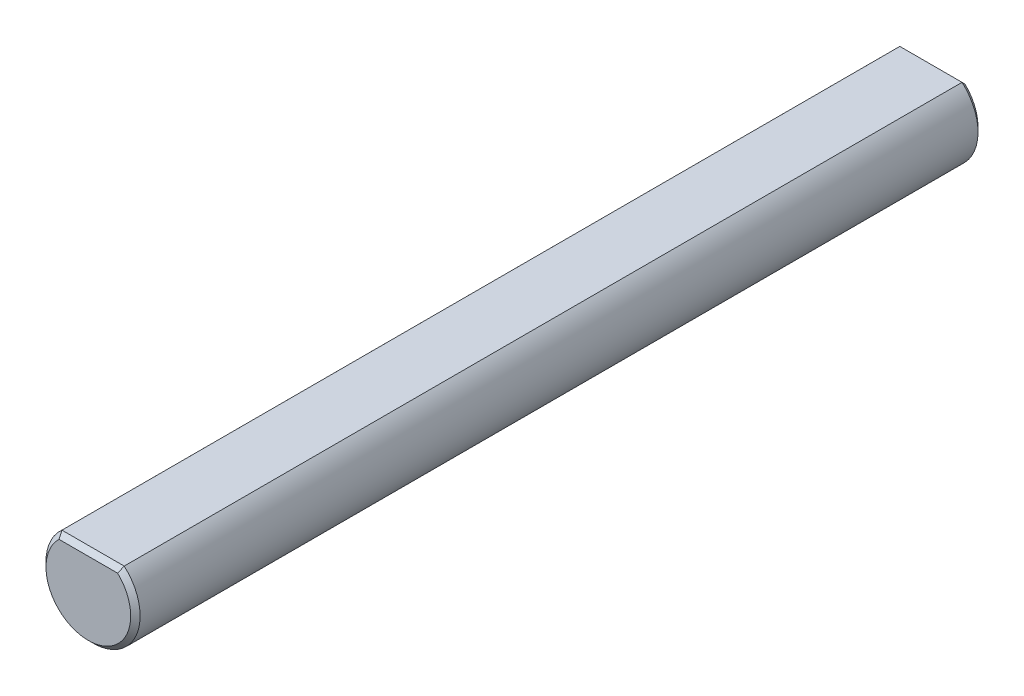
ISO-10303-21;
HEADER;
FILE_DESCRIPTION(('STEP AP214'),'2;1');
FILE_NAME('part.step','',(''),(''),'','','');
FILE_SCHEMA(('AUTOMOTIVE_DESIGN { 1 0 10303 214 1 1 1 1 }'));
ENDSEC;
DATA;
#1=APPLICATION_CONTEXT('core data for automotive mechanical design processes');
#2=APPLICATION_PROTOCOL_DEFINITION('international standard','automotive_design',2000,#1);
#3=PRODUCT_CONTEXT('',#1,'mechanical');
#4=PRODUCT('Part','Part','',(#3));
#5=PRODUCT_RELATED_PRODUCT_CATEGORY('part','',(#4));
#6=PRODUCT_DEFINITION_FORMATION('','',#4);
#7=PRODUCT_DEFINITION_CONTEXT('part definition',#1,'design');
#8=PRODUCT_DEFINITION('design','',#6,#7);
#9=PRODUCT_DEFINITION_SHAPE('','',#8);
#10=(LENGTH_UNIT() NAMED_UNIT(*) SI_UNIT(.MILLI.,.METRE.));
#11=(NAMED_UNIT(*) PLANE_ANGLE_UNIT() SI_UNIT($,.RADIAN.));
#12=(NAMED_UNIT(*) SI_UNIT($,.STERADIAN.) SOLID_ANGLE_UNIT());
#13=UNCERTAINTY_MEASURE_WITH_UNIT(LENGTH_MEASURE(1.E-05),#10,'distance_accuracy_value','');
#14=(GEOMETRIC_REPRESENTATION_CONTEXT(3) GLOBAL_UNCERTAINTY_ASSIGNED_CONTEXT((#13)) GLOBAL_UNIT_ASSIGNED_CONTEXT((#10,
#11,#12)) REPRESENTATION_CONTEXT('',''));
#15=CARTESIAN_POINT('',(0.,0.,0.));
#16=DIRECTION('',(0.,0.,1.));
#17=DIRECTION('',(1.,0.,0.));
#18=AXIS2_PLACEMENT_3D('',#15,#16,#17);
#19=CARTESIAN_POINT('',(0.,1.5,35.8));
#20=DIRECTION('',(0.,-0.707106781186554,-0.707106781186541));
#21=DIRECTION('',(0.,0.707106781186541,-0.707106781186554));
#22=AXIS2_PLACEMENT_3D('',#19,#20,#21);
#23=PLANE('',#22);
#24=CARTESIAN_POINT('',(-1.24498995973543,1.30000000003125,35.9999999999703));
#25=CARTESIAN_POINT('',(-1.25833682013213,1.33326211369787,35.9667378863029));
#26=CARTESIAN_POINT('',(-1.27150072997617,1.36655985044189,35.9334401495584));
#27=CARTESIAN_POINT('',(-1.29746262796961,1.43322651721416,35.8667734827856));
#28=CARTESIAN_POINT('',(-1.31026061669937,1.46659544712942,35.8334045528703));
#29=CARTESIAN_POINT('',(-1.32287565545683,1.50000000000907,35.7999999999909));
#30=B_SPLINE_CURVE_WITH_KNOTS('',3,(#24,#25,#26,#27,#28,#29),.UNSPECIFIED.,.F.,.F.,(4,2,4),(0.,
0.146686412467779,0.293372592274039),.UNSPECIFIED.);
#31=CARTESIAN_POINT('',(-1.24498995976297,1.3,35.9999999999723));
#32=VERTEX_POINT('',#31);
#33=CARTESIAN_POINT('',(-1.32287565549256,1.5,35.8));
#34=VERTEX_POINT('',#33);
#35=EDGE_CURVE('E63',#32,#34,#30,.T.);
#36=ORIENTED_EDGE('',*,*,#35,.F.);
#37=DIRECTION('',(1.,0.,0.));
#38=VECTOR('',#37,1.);
#39=CARTESIAN_POINT('',(0.,1.3,36.));
#40=LINE('',#39,#38);
#41=CARTESIAN_POINT('',(1.24498995976911,1.30000000001527,35.999999999957));
#42=VERTEX_POINT('',#41);
#43=EDGE_CURVE('E75',#42,#32,#40,.F.);
#44=ORIENTED_EDGE('',*,*,#43,.F.);
#45=CARTESIAN_POINT('',(1.32287565545647,1.50000000000964,35.7999999999904));
#46=CARTESIAN_POINT('',(1.31026061669923,1.46659544712999,35.83340455287));
#47=CARTESIAN_POINT('',(1.29746262796962,1.43322651721462,35.8667734827854));
#48=CARTESIAN_POINT('',(1.27150072997634,1.36655985044189,35.9334401495581));
#49=CARTESIAN_POINT('',(1.25833682013232,1.33326211369754,35.9667378863025));
#50=CARTESIAN_POINT('',(1.24498995973556,1.30000000003046,35.9999999999695));
#51=B_SPLINE_CURVE_WITH_KNOTS('',3,(#45,#46,#47,#48,#49,#50),.UNSPECIFIED.,.F.,.F.,(4,2,4),(0.,
0.1466861798066,0.293372592274723),.UNSPECIFIED.);
#52=CARTESIAN_POINT('',(1.32287565549438,1.50000000000482,35.7999999999937));
#53=VERTEX_POINT('',#52);
#54=EDGE_CURVE('E22',#53,#42,#51,.T.);
#55=ORIENTED_EDGE('',*,*,#54,.F.);
#56=DIRECTION('',(1.,0.,0.));
#57=VECTOR('',#56,1.);
#58=CARTESIAN_POINT('',(0.,1.5,35.8));
#59=LINE('',#58,#57);
#60=EDGE_CURVE('E73',#34,#53,#59,.T.);
#61=ORIENTED_EDGE('',*,*,#60,.F.);
#62=EDGE_LOOP('',(#36,#44,#55,#61));
#63=FACE_BOUND('',#62,.T.);
#64=ADVANCED_FACE('F18',(#63),#23,.F.);
#65=CARTESIAN_POINT('',(0.,1.3,0.));
#66=DIRECTION('',(0.,0.707106781186548,-0.707106781186548));
#67=DIRECTION('',(0.,0.707106781186548,0.707106781186548));
#68=AXIS2_PLACEMENT_3D('',#65,#66,#67);
#69=PLANE('',#68);
#70=CARTESIAN_POINT('',(1.24498995966782,1.30000000007248,5.93277109297435E-11));
#71=CARTESIAN_POINT('',(1.25833682006214,1.33326211373517,0.0332621137285962));
#72=CARTESIAN_POINT('',(1.27150072990418,1.36655985047615,0.0665598504739594));
#73=CARTESIAN_POINT('',(1.29746262789439,1.43322651724414,0.133226517246334));
#74=CARTESIAN_POINT('',(1.31026061662292,1.46659544715815,0.16659544716034));
#75=CARTESIAN_POINT('',(1.32287565537953,1.50000000003744,0.200000000037437));
#76=B_SPLINE_CURVE_WITH_KNOTS('',3,(#70,#71,#72,#73,#74,#75),.UNSPECIFIED.,.F.,.F.,(4,2,4),(0.,
0.146686412461685,0.293372592261853),.UNSPECIFIED.);
#77=CARTESIAN_POINT('',(1.24498995972612,1.30000000004097,9.00401118724553E-11));
#78=VERTEX_POINT('',#77);
#79=CARTESIAN_POINT('',(1.32287565544856,1.5,0.199999999999999));
#80=VERTEX_POINT('',#79);
#81=EDGE_CURVE('E76',#78,#80,#76,.T.);
#82=ORIENTED_EDGE('',*,*,#81,.F.);
#83=DIRECTION('',(1.,0.,0.));
#84=VECTOR('',#83,1.);
#85=CARTESIAN_POINT('',(0.,1.30000000001554,0.));
#86=LINE('',#85,#84);
#87=CARTESIAN_POINT('',(-1.24498995972612,1.30000000004097,9.00402034619802E-11));
#88=VERTEX_POINT('',#87);
#89=EDGE_CURVE('E88',#78,#88,#86,.F.);
#90=ORIENTED_EDGE('',*,*,#89,.T.);
#91=CARTESIAN_POINT('',(-1.32287565537873,1.50000000003682,0.200000000036819));
#92=CARTESIAN_POINT('',(-1.31026061662277,1.46659544715863,0.166595447158627));
#93=CARTESIAN_POINT('',(-1.29746262789445,1.43322651724471,0.133226517244705));
#94=CARTESIAN_POINT('',(-1.27150072990383,1.36655985047486,0.0665598504748567));
#95=CARTESIAN_POINT('',(-1.25833682006116,1.33326211373194,0.0332621137319352));
#96=CARTESIAN_POINT('',(-1.24498995966578,1.30000000006629,6.62877185196486E-11));
#97=B_SPLINE_CURVE_WITH_KNOTS('',3,(#91,#92,#93,#94,#95,#96),.UNSPECIFIED.,.F.,.F.,(4,2,4),(0.,
0.14668617979965,0.293372592260823),.UNSPECIFIED.);
#98=CARTESIAN_POINT('',(-1.32287565545551,1.50000000001841,0.200000000020092));
#99=VERTEX_POINT('',#98);
#100=EDGE_CURVE('E92',#99,#88,#97,.T.);
#101=ORIENTED_EDGE('',*,*,#100,.F.);
#102=DIRECTION('',(1.,0.,0.));
#103=VECTOR('',#102,1.);
#104=CARTESIAN_POINT('',(0.,1.5,0.199999999999999));
#105=LINE('',#104,#103);
#106=EDGE_CURVE('E83',#80,#99,#105,.F.);
#107=ORIENTED_EDGE('',*,*,#106,.F.);
#108=EDGE_LOOP('',(#82,#90,#101,#107));
#109=FACE_BOUND('',#108,.T.);
#110=ADVANCED_FACE('F111',(#109),#69,.T.);
#111=CARTESIAN_POINT('',(0.,0.,36.));
#112=DIRECTION('',(0.,0.,1.));
#113=DIRECTION('',(1.,0.,0.));
#114=AXIS2_PLACEMENT_3D('',#111,#112,#113);
#115=PLANE('',#114);
#116=ORIENTED_EDGE('',*,*,#43,.T.);
#117=CARTESIAN_POINT('',(0.,0.,35.9999999999445));
#118=DIRECTION('',(0.,0.,-1.));
#119=DIRECTION('',(-1.,0.,0.));
#120=AXIS2_PLACEMENT_3D('',#117,#118,#119);
#121=CIRCLE('',#120,1.80000000000291);
#122=EDGE_CURVE('E87',#42,#32,#121,.T.);
#123=ORIENTED_EDGE('',*,*,#122,.F.);
#124=EDGE_LOOP('',(#116,#123));
#125=FACE_BOUND('',#124,.T.);
#126=ADVANCED_FACE('F115',(#125),#115,.T.);
#127=CARTESIAN_POINT('',(0.,1.5,36.));
#128=DIRECTION('',(0.,1.,0.));
#129=DIRECTION('',(0.,0.,1.));
#130=AXIS2_PLACEMENT_3D('',#127,#128,#129);
#131=PLANE('',#130);
#132=DIRECTION('',(0.,0.,-1.));
#133=VECTOR('',#132,1.);
#134=CARTESIAN_POINT('',(1.32287565550936,1.50000000002023,36.));
#135=LINE('',#134,#133);
#136=EDGE_CURVE('E81',#80,#53,#135,.F.);
#137=ORIENTED_EDGE('',*,*,#136,.F.);
#138=ORIENTED_EDGE('',*,*,#106,.T.);
#139=DIRECTION('',(0.,0.,-1.));
#140=VECTOR('',#139,1.);
#141=CARTESIAN_POINT('',(-1.32287565550995,1.50000000001971,36.));
#142=LINE('',#141,#140);
#143=EDGE_CURVE('E82',#34,#99,#142,.T.);
#144=ORIENTED_EDGE('',*,*,#143,.F.);
#145=ORIENTED_EDGE('',*,*,#60,.T.);
#146=EDGE_LOOP('',(#137,#138,#144,#145));
#147=FACE_BOUND('',#146,.T.);
#148=ADVANCED_FACE('F79',(#147),#131,.T.);
#149=CARTESIAN_POINT('',(0.,0.,0.));
#150=DIRECTION('',(0.,0.,1.));
#151=DIRECTION('',(1.,0.,0.));
#152=AXIS2_PLACEMENT_3D('',#149,#150,#151);
#153=PLANE('',#152);
#154=ORIENTED_EDGE('',*,*,#89,.F.);
#155=CARTESIAN_POINT('',(0.,0.,1.13686837721616E-10));
#156=DIRECTION('',(0.,0.,1.));
#157=DIRECTION('',(1.,0.,0.));
#158=AXIS2_PLACEMENT_3D('',#155,#156,#157);
#159=CIRCLE('',#158,1.80000000000291);
#160=EDGE_CURVE('E69',#88,#78,#159,.T.);
#161=ORIENTED_EDGE('',*,*,#160,.F.);
#162=EDGE_LOOP('',(#154,#161));
#163=FACE_BOUND('',#162,.T.);
#164=ADVANCED_FACE('F130',(#163),#153,.F.);
#165=CARTESIAN_POINT('',(0.,0.,35.8000000000516));
#166=DIRECTION('',(0.,0.,-1.));
#167=DIRECTION('',(-1.,0.,0.));
#168=AXIS2_PLACEMENT_3D('',#165,#166,#167);
#169=CONICAL_SURFACE('',#168,1.99999999989586,0.785398163397448);
#170=ORIENTED_EDGE('',*,*,#122,.T.);
#171=ORIENTED_EDGE('',*,*,#35,.T.);
#172=CARTESIAN_POINT('',(0.,0.,35.8));
#173=DIRECTION('',(0.,0.,-1.));
#174=DIRECTION('',(-1.,0.,0.));
#175=AXIS2_PLACEMENT_3D('',#172,#173,#174);
#176=CIRCLE('',#175,2.);
#177=EDGE_CURVE('E32',#53,#34,#176,.T.);
#178=ORIENTED_EDGE('',*,*,#177,.F.);
#179=ORIENTED_EDGE('',*,*,#54,.T.);
#180=EDGE_LOOP('',(#170,#171,#178,#179));
#181=FACE_BOUND('',#180,.T.);
#182=ADVANCED_FACE('F60',(#181),#169,.T.);
#183=CARTESIAN_POINT('',(0.,0.,0.200000000063483));
#184=DIRECTION('',(0.,0.,1.));
#185=DIRECTION('',(1.,0.,0.));
#186=AXIS2_PLACEMENT_3D('',#183,#184,#185);
#187=CONICAL_SURFACE('',#186,1.99999999995271,0.785398163397448);
#188=ORIENTED_EDGE('',*,*,#160,.T.);
#189=ORIENTED_EDGE('',*,*,#81,.T.);
#190=CARTESIAN_POINT('',(0.,0.,0.199999999999999));
#191=DIRECTION('',(0.,0.,-1.));
#192=DIRECTION('',(-1.,0.,0.));
#193=AXIS2_PLACEMENT_3D('',#190,#191,#192);
#194=CIRCLE('',#193,2.);
#195=EDGE_CURVE('E11',#99,#80,#194,.F.);
#196=ORIENTED_EDGE('',*,*,#195,.F.);
#197=ORIENTED_EDGE('',*,*,#100,.T.);
#198=EDGE_LOOP('',(#188,#189,#196,#197));
#199=FACE_BOUND('',#198,.T.);
#200=ADVANCED_FACE('F108',(#199),#187,.T.);
#201=CARTESIAN_POINT('',(0.,0.,36.));
#202=DIRECTION('',(0.,0.,-1.));
#203=DIRECTION('',(-1.,0.,0.));
#204=AXIS2_PLACEMENT_3D('',#201,#202,#203);
#205=CYLINDRICAL_SURFACE('',#204,2.);
#206=ORIENTED_EDGE('',*,*,#177,.T.);
#207=ORIENTED_EDGE('',*,*,#143,.T.);
#208=ORIENTED_EDGE('',*,*,#195,.T.);
#209=ORIENTED_EDGE('',*,*,#136,.T.);
#210=EDGE_LOOP('',(#206,#207,#208,#209));
#211=FACE_BOUND('',#210,.T.);
#212=ADVANCED_FACE('F85',(#211),#205,.T.);
#213=CLOSED_SHELL('',(#64,#110,#126,#148,#164,#182,#200,#212));
#214=MANIFOLD_SOLID_BREP('B1',#213);
#215=ADVANCED_BREP_SHAPE_REPRESENTATION('',(#18,#214),#14);
#216=SHAPE_DEFINITION_REPRESENTATION(#9,#215);
ENDSEC;
END-ISO-10303-21;
